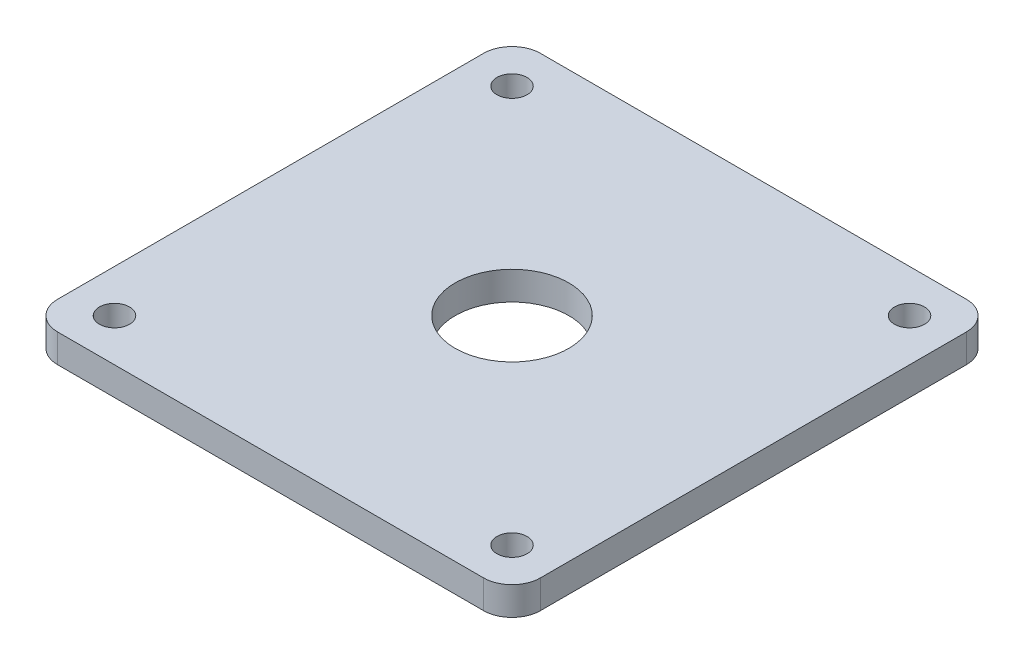
ISO-10303-21;
HEADER;
FILE_DESCRIPTION(('STEP AP214'),'2;1');
FILE_NAME('part.step','',(''),(''),'','','');
FILE_SCHEMA(('AUTOMOTIVE_DESIGN { 1 0 10303 214 1 1 1 1 }'));
ENDSEC;
DATA;
#1=APPLICATION_CONTEXT('core data for automotive mechanical design processes');
#2=APPLICATION_PROTOCOL_DEFINITION('international standard','automotive_design',2000,#1);
#3=PRODUCT_CONTEXT('',#1,'mechanical');
#4=PRODUCT('Part','Part','',(#3));
#5=PRODUCT_RELATED_PRODUCT_CATEGORY('part','',(#4));
#6=PRODUCT_DEFINITION_FORMATION('','',#4);
#7=PRODUCT_DEFINITION_CONTEXT('part definition',#1,'design');
#8=PRODUCT_DEFINITION('design','',#6,#7);
#9=PRODUCT_DEFINITION_SHAPE('','',#8);
#10=(LENGTH_UNIT() NAMED_UNIT(*) SI_UNIT(.MILLI.,.METRE.));
#11=(NAMED_UNIT(*) PLANE_ANGLE_UNIT() SI_UNIT($,.RADIAN.));
#12=(NAMED_UNIT(*) SI_UNIT($,.STERADIAN.) SOLID_ANGLE_UNIT());
#13=UNCERTAINTY_MEASURE_WITH_UNIT(LENGTH_MEASURE(1.E-05),#10,'distance_accuracy_value','');
#14=(GEOMETRIC_REPRESENTATION_CONTEXT(3) GLOBAL_UNCERTAINTY_ASSIGNED_CONTEXT((#13)) GLOBAL_UNIT_ASSIGNED_CONTEXT((#10,
#11,#12)) REPRESENTATION_CONTEXT('',''));
#15=CARTESIAN_POINT('',(0.,0.,0.));
#16=DIRECTION('',(0.,0.,1.));
#17=DIRECTION('',(1.,0.,0.));
#18=AXIS2_PLACEMENT_3D('',#15,#16,#17);
#19=CARTESIAN_POINT('',(0.,0.,0.));
#20=DIRECTION('',(0.,1.,0.));
#21=DIRECTION('',(0.,0.,1.));
#22=AXIS2_PLACEMENT_3D('',#19,#20,#21);
#23=PLANE('',#22);
#24=CARTESIAN_POINT('',(-44.45,0.,-44.45));
#25=DIRECTION('',(0.,1.,0.));
#26=DIRECTION('',(0.,0.,1.));
#27=AXIS2_PLACEMENT_3D('',#24,#25,#26);
#28=CIRCLE('',#27,3.3655);
#29=CARTESIAN_POINT('',(-44.45,0.,-41.0845));
#30=VERTEX_POINT('',#29);
#31=EDGE_CURVE('E142',#30,#30,#28,.T.);
#32=ORIENTED_EDGE('',*,*,#31,.T.);
#33=EDGE_LOOP('',(#32));
#34=FACE_BOUND('',#33,.T.);
#35=CARTESIAN_POINT('',(0.,0.,0.));
#36=DIRECTION('',(0.,1.,0.));
#37=DIRECTION('',(0.,0.,1.));
#38=AXIS2_PLACEMENT_3D('',#35,#36,#37);
#39=CIRCLE('',#38,12.7);
#40=CARTESIAN_POINT('',(0.,0.,12.7));
#41=VERTEX_POINT('',#40);
#42=EDGE_CURVE('E145',#41,#41,#39,.T.);
#43=ORIENTED_EDGE('',*,*,#42,.T.);
#44=EDGE_LOOP('',(#43));
#45=FACE_BOUND('',#44,.T.);
#46=CARTESIAN_POINT('',(44.45,0.,-44.45));
#47=DIRECTION('',(0.,1.,0.));
#48=DIRECTION('',(0.,0.,1.));
#49=AXIS2_PLACEMENT_3D('',#46,#47,#48);
#50=CIRCLE('',#49,3.3655);
#51=CARTESIAN_POINT('',(44.45,0.,-41.0845));
#52=VERTEX_POINT('',#51);
#53=EDGE_CURVE('E148',#52,#52,#50,.T.);
#54=ORIENTED_EDGE('',*,*,#53,.T.);
#55=EDGE_LOOP('',(#54));
#56=FACE_BOUND('',#55,.T.);
#57=CARTESIAN_POINT('',(44.45,0.,44.45));
#58=DIRECTION('',(0.,1.,0.));
#59=DIRECTION('',(0.,0.,1.));
#60=AXIS2_PLACEMENT_3D('',#57,#58,#59);
#61=CIRCLE('',#60,3.3655);
#62=CARTESIAN_POINT('',(44.45,0.,47.8155));
#63=VERTEX_POINT('',#62);
#64=EDGE_CURVE('E151',#63,#63,#61,.T.);
#65=ORIENTED_EDGE('',*,*,#64,.T.);
#66=EDGE_LOOP('',(#65));
#67=FACE_BOUND('',#66,.T.);
#68=CARTESIAN_POINT('',(-44.45,0.,44.45));
#69=DIRECTION('',(0.,1.,0.));
#70=DIRECTION('',(0.,0.,1.));
#71=AXIS2_PLACEMENT_3D('',#68,#69,#70);
#72=CIRCLE('',#71,3.3655);
#73=CARTESIAN_POINT('',(-44.45,0.,47.8155));
#74=VERTEX_POINT('',#73);
#75=EDGE_CURVE('E154',#74,#74,#72,.T.);
#76=ORIENTED_EDGE('',*,*,#75,.T.);
#77=EDGE_LOOP('',(#76));
#78=FACE_BOUND('',#77,.T.);
#79=CARTESIAN_POINT('',(-47.625,0.,-47.625));
#80=DIRECTION('',(0.,-1.,0.));
#81=DIRECTION('',(0.,0.,-1.));
#82=AXIS2_PLACEMENT_3D('',#79,#80,#81);
#83=CIRCLE('',#82,6.35);
#84=CARTESIAN_POINT('',(-47.625,0.,-53.975));
#85=VERTEX_POINT('',#84);
#86=CARTESIAN_POINT('',(-53.975,0.,-47.625));
#87=VERTEX_POINT('',#86);
#88=EDGE_CURVE('E160',#85,#87,#83,.F.);
#89=ORIENTED_EDGE('',*,*,#88,.F.);
#90=DIRECTION('',(-1.,0.,0.));
#91=VECTOR('',#90,1.);
#92=CARTESIAN_POINT('',(53.975,0.,-53.975));
#93=LINE('',#92,#91);
#94=CARTESIAN_POINT('',(47.625,0.,-53.975));
#95=VERTEX_POINT('',#94);
#96=EDGE_CURVE('E114',#95,#85,#93,.T.);
#97=ORIENTED_EDGE('',*,*,#96,.F.);
#98=CARTESIAN_POINT('',(47.625,0.,-47.625));
#99=DIRECTION('',(0.,-1.,0.));
#100=DIRECTION('',(0.,0.,-1.));
#101=AXIS2_PLACEMENT_3D('',#98,#99,#100);
#102=CIRCLE('',#101,6.35);
#103=CARTESIAN_POINT('',(53.975,0.,-47.625));
#104=VERTEX_POINT('',#103);
#105=EDGE_CURVE('E88',#104,#95,#102,.F.);
#106=ORIENTED_EDGE('',*,*,#105,.F.);
#107=DIRECTION('',(0.,0.,-1.));
#108=VECTOR('',#107,1.);
#109=CARTESIAN_POINT('',(53.975,0.,53.975));
#110=LINE('',#109,#108);
#111=CARTESIAN_POINT('',(53.975,0.,47.625));
#112=VERTEX_POINT('',#111);
#113=EDGE_CURVE('E83',#112,#104,#110,.T.);
#114=ORIENTED_EDGE('',*,*,#113,.F.);
#115=CARTESIAN_POINT('',(47.625,0.,47.625));
#116=DIRECTION('',(0.,-1.,0.));
#117=DIRECTION('',(0.,0.,-1.));
#118=AXIS2_PLACEMENT_3D('',#115,#116,#117);
#119=CIRCLE('',#118,6.35);
#120=CARTESIAN_POINT('',(47.625,0.,53.975));
#121=VERTEX_POINT('',#120);
#122=EDGE_CURVE('E20',#121,#112,#119,.F.);
#123=ORIENTED_EDGE('',*,*,#122,.F.);
#124=DIRECTION('',(1.,0.,0.));
#125=VECTOR('',#124,1.);
#126=CARTESIAN_POINT('',(-53.975,0.,53.975));
#127=LINE('',#126,#125);
#128=CARTESIAN_POINT('',(-47.625,0.,53.975));
#129=VERTEX_POINT('',#128);
#130=EDGE_CURVE('E78',#129,#121,#127,.T.);
#131=ORIENTED_EDGE('',*,*,#130,.F.);
#132=CARTESIAN_POINT('',(-47.625,0.,47.625));
#133=DIRECTION('',(0.,-1.,0.));
#134=DIRECTION('',(0.,0.,-1.));
#135=AXIS2_PLACEMENT_3D('',#132,#133,#134);
#136=CIRCLE('',#135,6.35);
#137=CARTESIAN_POINT('',(-53.975,0.,47.625));
#138=VERTEX_POINT('',#137);
#139=EDGE_CURVE('E157',#138,#129,#136,.F.);
#140=ORIENTED_EDGE('',*,*,#139,.F.);
#141=DIRECTION('',(0.,0.,1.));
#142=VECTOR('',#141,1.);
#143=CARTESIAN_POINT('',(-53.975,0.,-53.975));
#144=LINE('',#143,#142);
#145=EDGE_CURVE('E109',#87,#138,#144,.T.);
#146=ORIENTED_EDGE('',*,*,#145,.F.);
#147=EDGE_LOOP('',(#89,#97,#106,#114,#123,#131,#140,#146));
#148=FACE_BOUND('',#147,.T.);
#149=ADVANCED_FACE('F17',(#34,#45,#56,#67,#78,#148),#23,.F.);
#150=CARTESIAN_POINT('',(-53.975,0.,53.975));
#151=DIRECTION('',(0.,0.,1.));
#152=DIRECTION('',(1.,0.,0.));
#153=AXIS2_PLACEMENT_3D('',#150,#151,#152);
#154=PLANE('',#153);
#155=DIRECTION('',(1.,0.,0.));
#156=VECTOR('',#155,1.);
#157=CARTESIAN_POINT('',(0.,6.35,53.975));
#158=LINE('',#157,#156);
#159=CARTESIAN_POINT('',(-47.625,6.35,53.975));
#160=VERTEX_POINT('',#159);
#161=CARTESIAN_POINT('',(47.625,6.35,53.975));
#162=VERTEX_POINT('',#161);
#163=EDGE_CURVE('E141',#160,#162,#158,.T.);
#164=ORIENTED_EDGE('',*,*,#163,.F.);
#165=DIRECTION('',(0.,-1.,0.));
#166=VECTOR('',#165,1.);
#167=CARTESIAN_POINT('',(-47.625,14.62786,53.975));
#168=LINE('',#167,#166);
#169=EDGE_CURVE('E111',#129,#160,#168,.F.);
#170=ORIENTED_EDGE('',*,*,#169,.F.);
#171=ORIENTED_EDGE('',*,*,#130,.T.);
#172=DIRECTION('',(0.,-1.,0.));
#173=VECTOR('',#172,1.);
#174=CARTESIAN_POINT('',(47.625,14.62786,53.975));
#175=LINE('',#174,#173);
#176=EDGE_CURVE('E98',#162,#121,#175,.T.);
#177=ORIENTED_EDGE('',*,*,#176,.F.);
#178=EDGE_LOOP('',(#164,#170,#171,#177));
#179=FACE_BOUND('',#178,.T.);
#180=ADVANCED_FACE('F193',(#179),#154,.T.);
#181=CARTESIAN_POINT('',(47.625,14.62786,47.625));
#182=DIRECTION('',(0.,-1.,0.));
#183=DIRECTION('',(0.,0.,-1.));
#184=AXIS2_PLACEMENT_3D('',#181,#182,#183);
#185=CYLINDRICAL_SURFACE('',#184,6.35);
#186=ORIENTED_EDGE('',*,*,#176,.T.);
#187=ORIENTED_EDGE('',*,*,#122,.T.);
#188=DIRECTION('',(0.,1.,0.));
#189=VECTOR('',#188,1.);
#190=CARTESIAN_POINT('',(53.975,0.,47.625));
#191=LINE('',#190,#189);
#192=CARTESIAN_POINT('',(53.975,6.35,47.625));
#193=VERTEX_POINT('',#192);
#194=EDGE_CURVE('E92',#193,#112,#191,.F.);
#195=ORIENTED_EDGE('',*,*,#194,.F.);
#196=CARTESIAN_POINT('',(47.625,6.35,47.625));
#197=DIRECTION('',(0.,-1.,0.));
#198=DIRECTION('',(0.,0.,-1.));
#199=AXIS2_PLACEMENT_3D('',#196,#197,#198);
#200=CIRCLE('',#199,6.35);
#201=EDGE_CURVE('E139',#162,#193,#200,.F.);
#202=ORIENTED_EDGE('',*,*,#201,.F.);
#203=EDGE_LOOP('',(#186,#187,#195,#202));
#204=FACE_BOUND('',#203,.T.);
#205=ADVANCED_FACE('F95',(#204),#185,.T.);
#206=CARTESIAN_POINT('',(53.975,0.,53.975));
#207=DIRECTION('',(1.,0.,0.));
#208=DIRECTION('',(0.,0.,-1.));
#209=AXIS2_PLACEMENT_3D('',#206,#207,#208);
#210=PLANE('',#209);
#211=DIRECTION('',(0.,0.,1.));
#212=VECTOR('',#211,1.);
#213=CARTESIAN_POINT('',(53.975,6.35,0.));
#214=LINE('',#213,#212);
#215=CARTESIAN_POINT('',(53.975,6.35,-47.625));
#216=VERTEX_POINT('',#215);
#217=EDGE_CURVE('E101',#193,#216,#214,.F.);
#218=ORIENTED_EDGE('',*,*,#217,.F.);
#219=ORIENTED_EDGE('',*,*,#194,.T.);
#220=ORIENTED_EDGE('',*,*,#113,.T.);
#221=DIRECTION('',(0.,-1.,0.));
#222=VECTOR('',#221,1.);
#223=CARTESIAN_POINT('',(53.975,14.62786,-47.625));
#224=LINE('',#223,#222);
#225=EDGE_CURVE('E103',#216,#104,#224,.T.);
#226=ORIENTED_EDGE('',*,*,#225,.F.);
#227=EDGE_LOOP('',(#218,#219,#220,#226));
#228=FACE_BOUND('',#227,.T.);
#229=ADVANCED_FACE('F99',(#228),#210,.T.);
#230=CARTESIAN_POINT('',(47.625,14.62786,-47.625));
#231=DIRECTION('',(0.,-1.,0.));
#232=DIRECTION('',(0.,0.,-1.));
#233=AXIS2_PLACEMENT_3D('',#230,#231,#232);
#234=CYLINDRICAL_SURFACE('',#233,6.35);
#235=ORIENTED_EDGE('',*,*,#225,.T.);
#236=ORIENTED_EDGE('',*,*,#105,.T.);
#237=DIRECTION('',(0.,1.,0.));
#238=VECTOR('',#237,1.);
#239=CARTESIAN_POINT('',(47.625,0.,-53.975));
#240=LINE('',#239,#238);
#241=CARTESIAN_POINT('',(47.625,6.35,-53.975));
#242=VERTEX_POINT('',#241);
#243=EDGE_CURVE('E115',#242,#95,#240,.F.);
#244=ORIENTED_EDGE('',*,*,#243,.F.);
#245=CARTESIAN_POINT('',(47.625,6.35,-47.625));
#246=DIRECTION('',(0.,-1.,0.));
#247=DIRECTION('',(0.,0.,-1.));
#248=AXIS2_PLACEMENT_3D('',#245,#246,#247);
#249=CIRCLE('',#248,6.35);
#250=EDGE_CURVE('E136',#216,#242,#249,.F.);
#251=ORIENTED_EDGE('',*,*,#250,.F.);
#252=EDGE_LOOP('',(#235,#236,#244,#251));
#253=FACE_BOUND('',#252,.T.);
#254=ADVANCED_FACE('F164',(#253),#234,.T.);
#255=CARTESIAN_POINT('',(53.975,0.,-53.975));
#256=DIRECTION('',(0.,0.,-1.));
#257=DIRECTION('',(-1.,0.,0.));
#258=AXIS2_PLACEMENT_3D('',#255,#256,#257);
#259=PLANE('',#258);
#260=DIRECTION('',(1.,0.,0.));
#261=VECTOR('',#260,1.);
#262=CARTESIAN_POINT('',(0.,6.35,-53.975));
#263=LINE('',#262,#261);
#264=CARTESIAN_POINT('',(-47.625,6.35,-53.975));
#265=VERTEX_POINT('',#264);
#266=EDGE_CURVE('E135',#242,#265,#263,.F.);
#267=ORIENTED_EDGE('',*,*,#266,.F.);
#268=ORIENTED_EDGE('',*,*,#243,.T.);
#269=ORIENTED_EDGE('',*,*,#96,.T.);
#270=DIRECTION('',(0.,-1.,0.));
#271=VECTOR('',#270,1.);
#272=CARTESIAN_POINT('',(-47.625,14.62786,-53.975));
#273=LINE('',#272,#271);
#274=EDGE_CURVE('E161',#265,#85,#273,.T.);
#275=ORIENTED_EDGE('',*,*,#274,.F.);
#276=EDGE_LOOP('',(#267,#268,#269,#275));
#277=FACE_BOUND('',#276,.T.);
#278=ADVANCED_FACE('F168',(#277),#259,.T.);
#279=CARTESIAN_POINT('',(-47.625,14.62786,-47.625));
#280=DIRECTION('',(0.,-1.,0.));
#281=DIRECTION('',(0.,0.,-1.));
#282=AXIS2_PLACEMENT_3D('',#279,#280,#281);
#283=CYLINDRICAL_SURFACE('',#282,6.35);
#284=ORIENTED_EDGE('',*,*,#274,.T.);
#285=ORIENTED_EDGE('',*,*,#88,.T.);
#286=DIRECTION('',(0.,1.,0.));
#287=VECTOR('',#286,1.);
#288=CARTESIAN_POINT('',(-53.975,0.,-47.625));
#289=LINE('',#288,#287);
#290=CARTESIAN_POINT('',(-53.975,6.35,-47.625));
#291=VERTEX_POINT('',#290);
#292=EDGE_CURVE('E112',#291,#87,#289,.F.);
#293=ORIENTED_EDGE('',*,*,#292,.F.);
#294=CARTESIAN_POINT('',(-47.625,6.35,-47.625));
#295=DIRECTION('',(0.,-1.,0.));
#296=DIRECTION('',(0.,0.,-1.));
#297=AXIS2_PLACEMENT_3D('',#294,#295,#296);
#298=CIRCLE('',#297,6.35);
#299=EDGE_CURVE('E132',#265,#291,#298,.F.);
#300=ORIENTED_EDGE('',*,*,#299,.F.);
#301=EDGE_LOOP('',(#284,#285,#293,#300));
#302=FACE_BOUND('',#301,.T.);
#303=ADVANCED_FACE('F190',(#302),#283,.T.);
#304=CARTESIAN_POINT('',(-53.975,0.,-53.975));
#305=DIRECTION('',(-1.,0.,0.));
#306=DIRECTION('',(0.,0.,1.));
#307=AXIS2_PLACEMENT_3D('',#304,#305,#306);
#308=PLANE('',#307);
#309=ORIENTED_EDGE('',*,*,#145,.T.);
#310=DIRECTION('',(0.,-1.,0.));
#311=VECTOR('',#310,1.);
#312=CARTESIAN_POINT('',(-53.975,14.62786,47.625));
#313=LINE('',#312,#311);
#314=CARTESIAN_POINT('',(-53.975,6.35,47.625));
#315=VERTEX_POINT('',#314);
#316=EDGE_CURVE('E35',#315,#138,#313,.T.);
#317=ORIENTED_EDGE('',*,*,#316,.F.);
#318=DIRECTION('',(0.,0.,1.));
#319=VECTOR('',#318,1.);
#320=CARTESIAN_POINT('',(-53.975,6.35,0.));
#321=LINE('',#320,#319);
#322=EDGE_CURVE('E131',#291,#315,#321,.T.);
#323=ORIENTED_EDGE('',*,*,#322,.F.);
#324=ORIENTED_EDGE('',*,*,#292,.T.);
#325=EDGE_LOOP('',(#309,#317,#323,#324));
#326=FACE_BOUND('',#325,.T.);
#327=ADVANCED_FACE('F186',(#326),#308,.T.);
#328=CARTESIAN_POINT('',(-47.625,14.62786,47.625));
#329=DIRECTION('',(0.,-1.,0.));
#330=DIRECTION('',(0.,0.,-1.));
#331=AXIS2_PLACEMENT_3D('',#328,#329,#330);
#332=CYLINDRICAL_SURFACE('',#331,6.35);
#333=ORIENTED_EDGE('',*,*,#316,.T.);
#334=ORIENTED_EDGE('',*,*,#139,.T.);
#335=ORIENTED_EDGE('',*,*,#169,.T.);
#336=CARTESIAN_POINT('',(-47.625,6.35,47.625));
#337=DIRECTION('',(0.,-1.,0.));
#338=DIRECTION('',(0.,0.,-1.));
#339=AXIS2_PLACEMENT_3D('',#336,#337,#338);
#340=CIRCLE('',#339,6.35);
#341=EDGE_CURVE('E128',#315,#160,#340,.F.);
#342=ORIENTED_EDGE('',*,*,#341,.F.);
#343=EDGE_LOOP('',(#333,#334,#335,#342));
#344=FACE_BOUND('',#343,.T.);
#345=ADVANCED_FACE('F192',(#344),#332,.T.);
#346=CARTESIAN_POINT('',(-44.45,0.,44.45));
#347=DIRECTION('',(0.,1.,0.));
#348=DIRECTION('',(0.,0.,1.));
#349=AXIS2_PLACEMENT_3D('',#346,#347,#348);
#350=CYLINDRICAL_SURFACE('',#349,3.3655);
#351=CARTESIAN_POINT('',(-44.45,6.35,44.45));
#352=DIRECTION('',(0.,1.,0.));
#353=DIRECTION('',(0.,0.,1.));
#354=AXIS2_PLACEMENT_3D('',#351,#352,#353);
#355=CIRCLE('',#354,3.3655);
#356=CARTESIAN_POINT('',(-44.45,6.35,47.8155));
#357=VERTEX_POINT('',#356);
#358=EDGE_CURVE('E125',#357,#357,#355,.F.);
#359=ORIENTED_EDGE('',*,*,#358,.F.);
#360=EDGE_LOOP('',(#359));
#361=FACE_BOUND('',#360,.T.);
#362=ORIENTED_EDGE('',*,*,#75,.F.);
#363=EDGE_LOOP('',(#362));
#364=FACE_BOUND('',#363,.T.);
#365=ADVANCED_FACE('F224',(#361,#364),#350,.F.);
#366=CARTESIAN_POINT('',(44.45,0.,44.45));
#367=DIRECTION('',(0.,1.,0.));
#368=DIRECTION('',(0.,0.,1.));
#369=AXIS2_PLACEMENT_3D('',#366,#367,#368);
#370=CYLINDRICAL_SURFACE('',#369,3.3655);
#371=CARTESIAN_POINT('',(44.45,6.35,44.45));
#372=DIRECTION('',(0.,1.,0.));
#373=DIRECTION('',(0.,0.,1.));
#374=AXIS2_PLACEMENT_3D('',#371,#372,#373);
#375=CIRCLE('',#374,3.3655);
#376=CARTESIAN_POINT('',(44.45,6.35,47.8155));
#377=VERTEX_POINT('',#376);
#378=EDGE_CURVE('E122',#377,#377,#375,.F.);
#379=ORIENTED_EDGE('',*,*,#378,.F.);
#380=EDGE_LOOP('',(#379));
#381=FACE_BOUND('',#380,.T.);
#382=ORIENTED_EDGE('',*,*,#64,.F.);
#383=EDGE_LOOP('',(#382));
#384=FACE_BOUND('',#383,.T.);
#385=ADVANCED_FACE('F220',(#381,#384),#370,.F.);
#386=CARTESIAN_POINT('',(44.45,0.,-44.45));
#387=DIRECTION('',(0.,1.,0.));
#388=DIRECTION('',(0.,0.,1.));
#389=AXIS2_PLACEMENT_3D('',#386,#387,#388);
#390=CYLINDRICAL_SURFACE('',#389,3.3655);
#391=CARTESIAN_POINT('',(44.45,6.35,-44.45));
#392=DIRECTION('',(0.,1.,0.));
#393=DIRECTION('',(0.,0.,1.));
#394=AXIS2_PLACEMENT_3D('',#391,#392,#393);
#395=CIRCLE('',#394,3.3655);
#396=CARTESIAN_POINT('',(44.45,6.35,-41.0845));
#397=VERTEX_POINT('',#396);
#398=EDGE_CURVE('E119',#397,#397,#395,.F.);
#399=ORIENTED_EDGE('',*,*,#398,.F.);
#400=EDGE_LOOP('',(#399));
#401=FACE_BOUND('',#400,.T.);
#402=ORIENTED_EDGE('',*,*,#53,.F.);
#403=EDGE_LOOP('',(#402));
#404=FACE_BOUND('',#403,.T.);
#405=ADVANCED_FACE('F216',(#401,#404),#390,.F.);
#406=CARTESIAN_POINT('',(0.,0.,0.));
#407=DIRECTION('',(0.,1.,0.));
#408=DIRECTION('',(0.,0.,1.));
#409=AXIS2_PLACEMENT_3D('',#406,#407,#408);
#410=CYLINDRICAL_SURFACE('',#409,12.7);
#411=CARTESIAN_POINT('',(0.,6.35,0.));
#412=DIRECTION('',(0.,1.,0.));
#413=DIRECTION('',(0.,0.,1.));
#414=AXIS2_PLACEMENT_3D('',#411,#412,#413);
#415=CIRCLE('',#414,12.7);
#416=CARTESIAN_POINT('',(0.,6.35,12.7));
#417=VERTEX_POINT('',#416);
#418=EDGE_CURVE('E26',#417,#417,#415,.F.);
#419=ORIENTED_EDGE('',*,*,#418,.F.);
#420=EDGE_LOOP('',(#419));
#421=FACE_BOUND('',#420,.T.);
#422=ORIENTED_EDGE('',*,*,#42,.F.);
#423=EDGE_LOOP('',(#422));
#424=FACE_BOUND('',#423,.T.);
#425=ADVANCED_FACE('F209',(#421,#424),#410,.F.);
#426=CARTESIAN_POINT('',(-44.45,0.,-44.45));
#427=DIRECTION('',(0.,1.,0.));
#428=DIRECTION('',(0.,0.,1.));
#429=AXIS2_PLACEMENT_3D('',#426,#427,#428);
#430=CYLINDRICAL_SURFACE('',#429,3.3655);
#431=CARTESIAN_POINT('',(-44.45,6.35,-44.45));
#432=DIRECTION('',(0.,1.,0.));
#433=DIRECTION('',(0.,0.,1.));
#434=AXIS2_PLACEMENT_3D('',#431,#432,#433);
#435=CIRCLE('',#434,3.3655);
#436=CARTESIAN_POINT('',(-44.45,6.35,-41.0845));
#437=VERTEX_POINT('',#436);
#438=EDGE_CURVE('E11',#437,#437,#435,.F.);
#439=ORIENTED_EDGE('',*,*,#438,.F.);
#440=EDGE_LOOP('',(#439));
#441=FACE_BOUND('',#440,.T.);
#442=ORIENTED_EDGE('',*,*,#31,.F.);
#443=EDGE_LOOP('',(#442));
#444=FACE_BOUND('',#443,.T.);
#445=ADVANCED_FACE('F203',(#441,#444),#430,.F.);
#446=CARTESIAN_POINT('',(0.,6.35,0.));
#447=DIRECTION('',(0.,1.,0.));
#448=DIRECTION('',(0.,0.,1.));
#449=AXIS2_PLACEMENT_3D('',#446,#447,#448);
#450=PLANE('',#449);
#451=ORIENTED_EDGE('',*,*,#438,.T.);
#452=EDGE_LOOP('',(#451));
#453=FACE_BOUND('',#452,.T.);
#454=ORIENTED_EDGE('',*,*,#418,.T.);
#455=EDGE_LOOP('',(#454));
#456=FACE_BOUND('',#455,.T.);
#457=ORIENTED_EDGE('',*,*,#398,.T.);
#458=EDGE_LOOP('',(#457));
#459=FACE_BOUND('',#458,.T.);
#460=ORIENTED_EDGE('',*,*,#378,.T.);
#461=EDGE_LOOP('',(#460));
#462=FACE_BOUND('',#461,.T.);
#463=ORIENTED_EDGE('',*,*,#358,.T.);
#464=EDGE_LOOP('',(#463));
#465=FACE_BOUND('',#464,.T.);
#466=ORIENTED_EDGE('',*,*,#322,.T.);
#467=ORIENTED_EDGE('',*,*,#341,.T.);
#468=ORIENTED_EDGE('',*,*,#163,.T.);
#469=ORIENTED_EDGE('',*,*,#201,.T.);
#470=ORIENTED_EDGE('',*,*,#217,.T.);
#471=ORIENTED_EDGE('',*,*,#250,.T.);
#472=ORIENTED_EDGE('',*,*,#266,.T.);
#473=ORIENTED_EDGE('',*,*,#299,.T.);
#474=EDGE_LOOP('',(#466,#467,#468,#469,#470,#471,#472,#473));
#475=FACE_BOUND('',#474,.T.);
#476=ADVANCED_FACE('F184',(#453,#456,#459,#462,#465,#475),#450,.T.);
#477=CLOSED_SHELL('',(#149,#180,#205,#229,#254,#278,#303,#327,#345,#365,#385,#405,#425,#445,#476));
#478=MANIFOLD_SOLID_BREP('B1',#477);
#479=ADVANCED_BREP_SHAPE_REPRESENTATION('',(#18,#478),#14);
#480=SHAPE_DEFINITION_REPRESENTATION(#9,#479);
ENDSEC;
END-ISO-10303-21;
